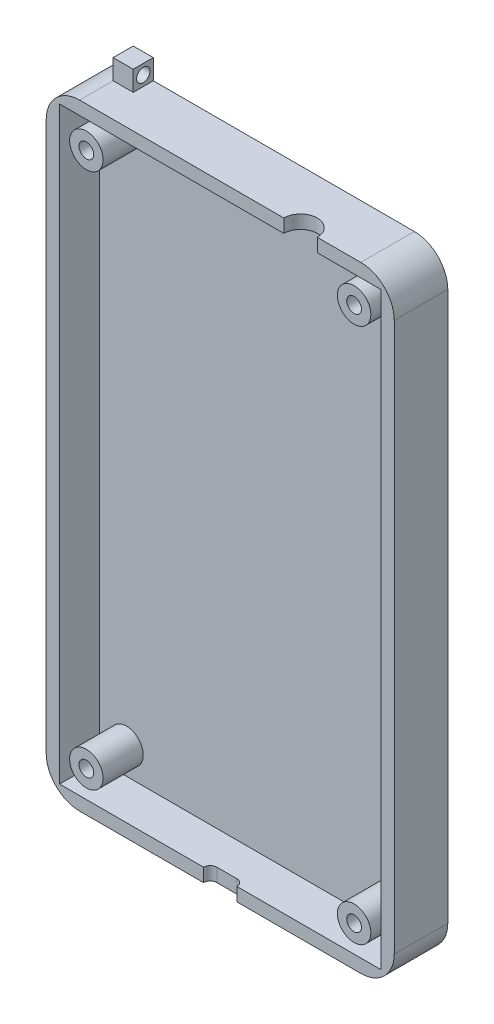
ISO-10303-21;
HEADER;
FILE_DESCRIPTION(('STEP AP214'),'2;1');
FILE_NAME('part.step','',(''),(''),'','','');
FILE_SCHEMA(('AUTOMOTIVE_DESIGN { 1 0 10303 214 1 1 1 1 }'));
ENDSEC;
DATA;
#1=APPLICATION_CONTEXT('core data for automotive mechanical design processes');
#2=APPLICATION_PROTOCOL_DEFINITION('international standard','automotive_design',2000,#1);
#3=PRODUCT_CONTEXT('',#1,'mechanical');
#4=PRODUCT('Part','Part','',(#3));
#5=PRODUCT_RELATED_PRODUCT_CATEGORY('part','',(#4));
#6=PRODUCT_DEFINITION_FORMATION('','',#4);
#7=PRODUCT_DEFINITION_CONTEXT('part definition',#1,'design');
#8=PRODUCT_DEFINITION('design','',#6,#7);
#9=PRODUCT_DEFINITION_SHAPE('','',#8);
#10=(LENGTH_UNIT() NAMED_UNIT(*) SI_UNIT(.MILLI.,.METRE.));
#11=(NAMED_UNIT(*) PLANE_ANGLE_UNIT() SI_UNIT($,.RADIAN.));
#12=(NAMED_UNIT(*) SI_UNIT($,.STERADIAN.) SOLID_ANGLE_UNIT());
#13=UNCERTAINTY_MEASURE_WITH_UNIT(LENGTH_MEASURE(1.E-05),#10,'distance_accuracy_value','');
#14=(GEOMETRIC_REPRESENTATION_CONTEXT(3) GLOBAL_UNCERTAINTY_ASSIGNED_CONTEXT((#13)) GLOBAL_UNIT_ASSIGNED_CONTEXT((#10,
#11,#12)) REPRESENTATION_CONTEXT('',''));
#15=CARTESIAN_POINT('',(0.,0.,0.));
#16=DIRECTION('',(0.,0.,1.));
#17=DIRECTION('',(1.,0.,0.));
#18=AXIS2_PLACEMENT_3D('',#15,#16,#17);
#19=CARTESIAN_POINT('',(24.,46.,8.));
#20=DIRECTION('',(0.,-1.,0.));
#21=DIRECTION('',(1.,0.,0.));
#22=AXIS2_PLACEMENT_3D('',#19,#20,#21);
#23=PLANE('',#22);
#24=DIRECTION('',(1.,0.,0.));
#25=VECTOR('',#24,1.);
#26=CARTESIAN_POINT('',(-21.,46.,3.));
#27=LINE('',#26,#25);
#28=CARTESIAN_POINT('',(-21.,46.,3.));
#29=VERTEX_POINT('',#28);
#30=CARTESIAN_POINT('',(-18.,46.,3.));
#31=VERTEX_POINT('',#30);
#32=EDGE_CURVE('E511',#29,#31,#27,.T.);
#33=ORIENTED_EDGE('',*,*,#32,.F.);
#34=DIRECTION('',(0.,0.,-1.));
#35=VECTOR('',#34,1.);
#36=CARTESIAN_POINT('',(-21.,46.,8.));
#37=LINE('',#36,#35);
#38=CARTESIAN_POINT('',(-21.,46.,8.));
#39=VERTEX_POINT('',#38);
#40=EDGE_CURVE('E382',#29,#39,#37,.F.);
#41=ORIENTED_EDGE('',*,*,#40,.T.);
#42=DIRECTION('',(-1.,0.,0.));
#43=VECTOR('',#42,1.);
#44=CARTESIAN_POINT('',(24.,46.,8.));
#45=LINE('',#44,#43);
#46=CARTESIAN_POINT('',(9.5,46.,8.));
#47=VERTEX_POINT('',#46);
#48=EDGE_CURVE('E377',#47,#39,#45,.T.);
#49=ORIENTED_EDGE('',*,*,#48,.F.);
#50=CARTESIAN_POINT('',(12.,46.,8.));
#51=DIRECTION('',(0.,1.,0.));
#52=DIRECTION('',(-1.,0.,0.));
#53=AXIS2_PLACEMENT_3D('',#50,#51,#52);
#54=CIRCLE('',#53,2.5);
#55=CARTESIAN_POINT('',(14.5,46.,8.));
#56=VERTEX_POINT('',#55);
#57=EDGE_CURVE('E258',#56,#47,#54,.T.);
#58=ORIENTED_EDGE('',*,*,#57,.F.);
#59=CARTESIAN_POINT('',(21.,46.,8.));
#60=VERTEX_POINT('',#59);
#61=EDGE_CURVE('E378',#60,#56,#45,.T.);
#62=ORIENTED_EDGE('',*,*,#61,.F.);
#63=DIRECTION('',(0.,0.,-1.));
#64=VECTOR('',#63,1.);
#65=CARTESIAN_POINT('',(21.,46.,8.));
#66=LINE('',#65,#64);
#67=CARTESIAN_POINT('',(21.,46.,0.));
#68=VERTEX_POINT('',#67);
#69=EDGE_CURVE('E398',#60,#68,#66,.T.);
#70=ORIENTED_EDGE('',*,*,#69,.T.);
#71=DIRECTION('',(-1.,0.,0.));
#72=VECTOR('',#71,1.);
#73=CARTESIAN_POINT('',(24.,46.,0.));
#74=LINE('',#73,#72);
#75=CARTESIAN_POINT('',(-18.,46.,0.));
#76=VERTEX_POINT('',#75);
#77=EDGE_CURVE('E88',#68,#76,#74,.T.);
#78=ORIENTED_EDGE('',*,*,#77,.T.);
#79=DIRECTION('',(0.,0.,-1.));
#80=VECTOR('',#79,1.);
#81=CARTESIAN_POINT('',(-18.,46.,0.));
#82=LINE('',#81,#80);
#83=EDGE_CURVE('E83',#31,#76,#82,.T.);
#84=ORIENTED_EDGE('',*,*,#83,.F.);
#85=EDGE_LOOP('',(#33,#41,#49,#58,#62,#70,#78,#84));
#86=FACE_BOUND('',#85,.T.);
#87=ADVANCED_FACE('F67',(#86),#23,.F.);
#88=CARTESIAN_POINT('',(0.,0.,8.));
#89=DIRECTION('',(0.,0.,1.));
#90=DIRECTION('',(1.,0.,0.));
#91=AXIS2_PLACEMENT_3D('',#88,#89,#90);
#92=PLANE('',#91);
#93=DIRECTION('',(0.,-1.,0.));
#94=VECTOR('',#93,1.);
#95=CARTESIAN_POINT('',(-2.5,0.,8.));
#96=LINE('',#95,#94);
#97=CARTESIAN_POINT('',(-2.5,-44.,8.));
#98=VERTEX_POINT('',#97);
#99=CARTESIAN_POINT('',(-2.5,-46.,8.));
#100=VERTEX_POINT('',#99);
#101=EDGE_CURVE('E254',#98,#100,#96,.T.);
#102=ORIENTED_EDGE('',*,*,#101,.F.);
#103=DIRECTION('',(1.,0.,0.));
#104=VECTOR('',#103,1.);
#105=CARTESIAN_POINT('',(24.,-44.,8.));
#106=LINE('',#105,#104);
#107=CARTESIAN_POINT('',(-24.,-44.,8.));
#108=VERTEX_POINT('',#107);
#109=EDGE_CURVE('E335',#108,#98,#106,.T.);
#110=ORIENTED_EDGE('',*,*,#109,.F.);
#111=DIRECTION('',(0.,-1.,0.));
#112=VECTOR('',#111,1.);
#113=CARTESIAN_POINT('',(-24.,-44.,8.));
#114=LINE('',#113,#112);
#115=CARTESIAN_POINT('',(-24.,44.,8.));
#116=VERTEX_POINT('',#115);
#117=EDGE_CURVE('E331',#116,#108,#114,.T.);
#118=ORIENTED_EDGE('',*,*,#117,.F.);
#119=DIRECTION('',(-1.,0.,0.));
#120=VECTOR('',#119,1.);
#121=CARTESIAN_POINT('',(24.,44.,8.));
#122=LINE('',#121,#120);
#123=CARTESIAN_POINT('',(9.5,44.,8.));
#124=VERTEX_POINT('',#123);
#125=EDGE_CURVE('E343',#124,#116,#122,.T.);
#126=ORIENTED_EDGE('',*,*,#125,.F.);
#127=DIRECTION('',(0.,1.,0.));
#128=VECTOR('',#127,1.);
#129=CARTESIAN_POINT('',(9.5,36.,8.));
#130=LINE('',#129,#128);
#131=EDGE_CURVE('E261',#47,#124,#130,.F.);
#132=ORIENTED_EDGE('',*,*,#131,.F.);
#133=ORIENTED_EDGE('',*,*,#48,.T.);
#134=CARTESIAN_POINT('',(-21.,41.,8.));
#135=DIRECTION('',(0.,0.,1.));
#136=DIRECTION('',(1.,0.,0.));
#137=AXIS2_PLACEMENT_3D('',#134,#135,#136);
#138=CIRCLE('',#137,5.);
#139=CARTESIAN_POINT('',(-26.,41.,8.));
#140=VERTEX_POINT('',#139);
#141=EDGE_CURVE('E420',#39,#140,#138,.T.);
#142=ORIENTED_EDGE('',*,*,#141,.T.);
#143=DIRECTION('',(0.,-1.,0.));
#144=VECTOR('',#143,1.);
#145=CARTESIAN_POINT('',(-26.,-44.,8.));
#146=LINE('',#145,#144);
#147=CARTESIAN_POINT('',(-26.,-41.,8.));
#148=VERTEX_POINT('',#147);
#149=EDGE_CURVE('E364',#140,#148,#146,.T.);
#150=ORIENTED_EDGE('',*,*,#149,.T.);
#151=CARTESIAN_POINT('',(-21.,-41.,8.));
#152=DIRECTION('',(0.,0.,1.));
#153=DIRECTION('',(1.,0.,0.));
#154=AXIS2_PLACEMENT_3D('',#151,#152,#153);
#155=CIRCLE('',#154,5.);
#156=CARTESIAN_POINT('',(-21.,-46.,8.));
#157=VERTEX_POINT('',#156);
#158=EDGE_CURVE('E423',#148,#157,#155,.T.);
#159=ORIENTED_EDGE('',*,*,#158,.T.);
#160=DIRECTION('',(1.,0.,0.));
#161=VECTOR('',#160,1.);
#162=CARTESIAN_POINT('',(24.,-46.,8.));
#163=LINE('',#162,#161);
#164=EDGE_CURVE('E369',#157,#100,#163,.T.);
#165=ORIENTED_EDGE('',*,*,#164,.T.);
#166=EDGE_LOOP('',(#102,#110,#118,#126,#132,#133,#142,#150,#159,#165));
#167=FACE_BOUND('',#166,.T.);
#168=ADVANCED_FACE('F516',(#167),#92,.T.);
#169=DIRECTION('',(0.,1.,0.));
#170=VECTOR('',#169,1.);
#171=CARTESIAN_POINT('',(2.5,0.,8.));
#172=LINE('',#171,#170);
#173=CARTESIAN_POINT('',(2.5,-46.,8.));
#174=VERTEX_POINT('',#173);
#175=CARTESIAN_POINT('',(2.5,-44.,8.));
#176=VERTEX_POINT('',#175);
#177=EDGE_CURVE('E245',#174,#176,#172,.T.);
#178=ORIENTED_EDGE('',*,*,#177,.F.);
#179=CARTESIAN_POINT('',(21.,-46.,8.));
#180=VERTEX_POINT('',#179);
#181=EDGE_CURVE('E368',#174,#180,#163,.T.);
#182=ORIENTED_EDGE('',*,*,#181,.T.);
#183=CARTESIAN_POINT('',(21.,-41.,8.));
#184=DIRECTION('',(0.,0.,1.));
#185=DIRECTION('',(1.,0.,0.));
#186=AXIS2_PLACEMENT_3D('',#183,#184,#185);
#187=CIRCLE('',#186,5.);
#188=CARTESIAN_POINT('',(26.,-41.,8.));
#189=VERTEX_POINT('',#188);
#190=EDGE_CURVE('E426',#180,#189,#187,.T.);
#191=ORIENTED_EDGE('',*,*,#190,.T.);
#192=DIRECTION('',(0.,1.,0.));
#193=VECTOR('',#192,1.);
#194=CARTESIAN_POINT('',(26.,-44.,8.));
#195=LINE('',#194,#193);
#196=CARTESIAN_POINT('',(26.,41.,8.));
#197=VERTEX_POINT('',#196);
#198=EDGE_CURVE('E373',#189,#197,#195,.T.);
#199=ORIENTED_EDGE('',*,*,#198,.T.);
#200=CARTESIAN_POINT('',(21.,41.,8.));
#201=DIRECTION('',(0.,0.,1.));
#202=DIRECTION('',(1.,0.,0.));
#203=AXIS2_PLACEMENT_3D('',#200,#201,#202);
#204=CIRCLE('',#203,5.);
#205=EDGE_CURVE('E429',#197,#60,#204,.T.);
#206=ORIENTED_EDGE('',*,*,#205,.T.);
#207=ORIENTED_EDGE('',*,*,#61,.T.);
#208=DIRECTION('',(0.,1.,0.));
#209=VECTOR('',#208,1.);
#210=CARTESIAN_POINT('',(14.5,36.,8.));
#211=LINE('',#210,#209);
#212=CARTESIAN_POINT('',(14.5,44.,8.));
#213=VERTEX_POINT('',#212);
#214=EDGE_CURVE('E264',#213,#56,#211,.T.);
#215=ORIENTED_EDGE('',*,*,#214,.F.);
#216=CARTESIAN_POINT('',(24.,44.,8.));
#217=VERTEX_POINT('',#216);
#218=EDGE_CURVE('E344',#217,#213,#122,.T.);
#219=ORIENTED_EDGE('',*,*,#218,.F.);
#220=DIRECTION('',(0.,1.,0.));
#221=VECTOR('',#220,1.);
#222=CARTESIAN_POINT('',(24.,-44.,8.));
#223=LINE('',#222,#221);
#224=CARTESIAN_POINT('',(24.,-44.,8.));
#225=VERTEX_POINT('',#224);
#226=EDGE_CURVE('E339',#225,#217,#223,.T.);
#227=ORIENTED_EDGE('',*,*,#226,.F.);
#228=EDGE_CURVE('E334',#176,#225,#106,.T.);
#229=ORIENTED_EDGE('',*,*,#228,.F.);
#230=EDGE_LOOP('',(#178,#182,#191,#199,#206,#207,#215,#219,#227,#229));
#231=FACE_BOUND('',#230,.T.);
#232=ADVANCED_FACE('F501',(#231),#92,.T.);
#233=CARTESIAN_POINT('',(0.,0.,0.));
#234=DIRECTION('',(0.,0.,1.));
#235=DIRECTION('',(1.,0.,0.));
#236=AXIS2_PLACEMENT_3D('',#233,#234,#235);
#237=PLANE('',#236);
#238=ORIENTED_EDGE('',*,*,#77,.F.);
#239=CARTESIAN_POINT('',(21.,41.,0.));
#240=DIRECTION('',(0.,0.,1.));
#241=DIRECTION('',(1.,0.,0.));
#242=AXIS2_PLACEMENT_3D('',#239,#240,#241);
#243=CIRCLE('',#242,5.);
#244=CARTESIAN_POINT('',(26.,41.,0.));
#245=VERTEX_POINT('',#244);
#246=EDGE_CURVE('E410',#68,#245,#243,.F.);
#247=ORIENTED_EDGE('',*,*,#246,.T.);
#248=DIRECTION('',(0.,1.,0.));
#249=VECTOR('',#248,1.);
#250=CARTESIAN_POINT('',(26.,-44.,0.));
#251=LINE('',#250,#249);
#252=CARTESIAN_POINT('',(26.,-41.,0.));
#253=VERTEX_POINT('',#252);
#254=EDGE_CURVE('E390',#253,#245,#251,.T.);
#255=ORIENTED_EDGE('',*,*,#254,.F.);
#256=CARTESIAN_POINT('',(21.,-41.,0.));
#257=DIRECTION('',(0.,0.,1.));
#258=DIRECTION('',(1.,0.,0.));
#259=AXIS2_PLACEMENT_3D('',#256,#257,#258);
#260=CIRCLE('',#259,5.);
#261=CARTESIAN_POINT('',(21.,-46.,0.));
#262=VERTEX_POINT('',#261);
#263=EDGE_CURVE('E407',#253,#262,#260,.F.);
#264=ORIENTED_EDGE('',*,*,#263,.T.);
#265=DIRECTION('',(1.,0.,0.));
#266=VECTOR('',#265,1.);
#267=CARTESIAN_POINT('',(24.,-46.,0.));
#268=LINE('',#267,#266);
#269=CARTESIAN_POINT('',(-21.,-46.,0.));
#270=VERTEX_POINT('',#269);
#271=EDGE_CURVE('E386',#270,#262,#268,.T.);
#272=ORIENTED_EDGE('',*,*,#271,.F.);
#273=CARTESIAN_POINT('',(-21.,-41.,0.));
#274=DIRECTION('',(0.,0.,1.));
#275=DIRECTION('',(1.,0.,0.));
#276=AXIS2_PLACEMENT_3D('',#273,#274,#275);
#277=CIRCLE('',#276,5.);
#278=CARTESIAN_POINT('',(-26.,-41.,0.));
#279=VERTEX_POINT('',#278);
#280=EDGE_CURVE('E404',#270,#279,#277,.F.);
#281=ORIENTED_EDGE('',*,*,#280,.T.);
#282=DIRECTION('',(0.,-1.,0.));
#283=VECTOR('',#282,1.);
#284=CARTESIAN_POINT('',(-26.,-44.,0.));
#285=LINE('',#284,#283);
#286=CARTESIAN_POINT('',(-26.,41.,0.));
#287=VERTEX_POINT('',#286);
#288=EDGE_CURVE('E363',#287,#279,#285,.T.);
#289=ORIENTED_EDGE('',*,*,#288,.F.);
#290=CARTESIAN_POINT('',(-21.,41.,0.));
#291=DIRECTION('',(0.,0.,1.));
#292=DIRECTION('',(1.,0.,0.));
#293=AXIS2_PLACEMENT_3D('',#290,#291,#292);
#294=CIRCLE('',#293,5.);
#295=CARTESIAN_POINT('',(-21.,46.,0.));
#296=VERTEX_POINT('',#295);
#297=EDGE_CURVE('E401',#287,#296,#294,.F.);
#298=ORIENTED_EDGE('',*,*,#297,.T.);
#299=DIRECTION('',(0.,-1.,0.));
#300=VECTOR('',#299,1.);
#301=CARTESIAN_POINT('',(-21.,49.,0.));
#302=LINE('',#301,#300);
#303=CARTESIAN_POINT('',(-21.,49.,0.));
#304=VERTEX_POINT('',#303);
#305=EDGE_CURVE('E700',#304,#296,#302,.T.);
#306=ORIENTED_EDGE('',*,*,#305,.F.);
#307=DIRECTION('',(-1.,0.,0.));
#308=VECTOR('',#307,1.);
#309=CARTESIAN_POINT('',(-21.,49.,0.));
#310=LINE('',#309,#308);
#311=CARTESIAN_POINT('',(-18.,49.,0.));
#312=VERTEX_POINT('',#311);
#313=EDGE_CURVE('E230',#312,#304,#310,.T.);
#314=ORIENTED_EDGE('',*,*,#313,.F.);
#315=DIRECTION('',(0.,-1.,0.));
#316=VECTOR('',#315,1.);
#317=CARTESIAN_POINT('',(-18.,49.,0.));
#318=LINE('',#317,#316);
#319=EDGE_CURVE('E247',#312,#76,#318,.T.);
#320=ORIENTED_EDGE('',*,*,#319,.T.);
#321=EDGE_LOOP('',(#238,#247,#255,#264,#272,#281,#289,#298,#306,#314,#320));
#322=FACE_BOUND('',#321,.T.);
#323=ADVANCED_FACE('F526',(#322),#237,.F.);
#324=CARTESIAN_POINT('',(-26.,-44.,8.));
#325=DIRECTION('',(1.,0.,0.));
#326=DIRECTION('',(0.,0.,-1.));
#327=AXIS2_PLACEMENT_3D('',#324,#325,#326);
#328=PLANE('',#327);
#329=ORIENTED_EDGE('',*,*,#288,.T.);
#330=DIRECTION('',(0.,0.,-1.));
#331=VECTOR('',#330,1.);
#332=CARTESIAN_POINT('',(-26.,-41.,8.));
#333=LINE('',#332,#331);
#334=EDGE_CURVE('E444',#279,#148,#333,.F.);
#335=ORIENTED_EDGE('',*,*,#334,.T.);
#336=ORIENTED_EDGE('',*,*,#149,.F.);
#337=DIRECTION('',(0.,0.,-1.));
#338=VECTOR('',#337,1.);
#339=CARTESIAN_POINT('',(-26.,41.,8.));
#340=LINE('',#339,#338);
#341=EDGE_CURVE('E440',#140,#287,#340,.T.);
#342=ORIENTED_EDGE('',*,*,#341,.T.);
#343=EDGE_LOOP('',(#329,#335,#336,#342));
#344=FACE_BOUND('',#343,.T.);
#345=ADVANCED_FACE('F523',(#344),#328,.F.);
#346=CARTESIAN_POINT('',(24.,-46.,8.));
#347=DIRECTION('',(0.,1.,0.));
#348=DIRECTION('',(-1.,0.,0.));
#349=AXIS2_PLACEMENT_3D('',#346,#347,#348);
#350=PLANE('',#349);
#351=DIRECTION('',(1.,0.,0.));
#352=VECTOR('',#351,1.);
#353=CARTESIAN_POINT('',(2.5,-46.,7.));
#354=LINE('',#353,#352);
#355=CARTESIAN_POINT('',(-1.5,-46.,7.));
#356=VERTEX_POINT('',#355);
#357=CARTESIAN_POINT('',(1.5,-46.,7.));
#358=VERTEX_POINT('',#357);
#359=EDGE_CURVE('E240',#356,#358,#354,.T.);
#360=ORIENTED_EDGE('',*,*,#359,.F.);
#361=CARTESIAN_POINT('',(-1.5,-46.,8.));
#362=DIRECTION('',(0.,1.,0.));
#363=DIRECTION('',(-1.,0.,0.));
#364=AXIS2_PLACEMENT_3D('',#361,#362,#363);
#365=CIRCLE('',#364,1.);
#366=EDGE_CURVE('E477',#356,#100,#365,.T.);
#367=ORIENTED_EDGE('',*,*,#366,.T.);
#368=ORIENTED_EDGE('',*,*,#164,.F.);
#369=DIRECTION('',(0.,0.,-1.));
#370=VECTOR('',#369,1.);
#371=CARTESIAN_POINT('',(-21.,-46.,8.));
#372=LINE('',#371,#370);
#373=EDGE_CURVE('E432',#157,#270,#372,.T.);
#374=ORIENTED_EDGE('',*,*,#373,.T.);
#375=ORIENTED_EDGE('',*,*,#271,.T.);
#376=DIRECTION('',(0.,0.,-1.));
#377=VECTOR('',#376,1.);
#378=CARTESIAN_POINT('',(21.,-46.,8.));
#379=LINE('',#378,#377);
#380=EDGE_CURVE('E436',#262,#180,#379,.F.);
#381=ORIENTED_EDGE('',*,*,#380,.T.);
#382=ORIENTED_EDGE('',*,*,#181,.F.);
#383=CARTESIAN_POINT('',(1.5,-46.,8.));
#384=DIRECTION('',(0.,1.,0.));
#385=DIRECTION('',(-1.,0.,0.));
#386=AXIS2_PLACEMENT_3D('',#383,#384,#385);
#387=CIRCLE('',#386,1.);
#388=EDGE_CURVE('E76',#174,#358,#387,.T.);
#389=ORIENTED_EDGE('',*,*,#388,.T.);
#390=EDGE_LOOP('',(#360,#367,#368,#374,#375,#381,#382,#389));
#391=FACE_BOUND('',#390,.T.);
#392=ADVANCED_FACE('F486',(#391),#350,.F.);
#393=CARTESIAN_POINT('',(26.,-44.,8.));
#394=DIRECTION('',(-1.,0.,0.));
#395=DIRECTION('',(0.,-1.,0.));
#396=AXIS2_PLACEMENT_3D('',#393,#394,#395);
#397=PLANE('',#396);
#398=ORIENTED_EDGE('',*,*,#254,.T.);
#399=DIRECTION('',(0.,0.,-1.));
#400=VECTOR('',#399,1.);
#401=CARTESIAN_POINT('',(26.,41.,8.));
#402=LINE('',#401,#400);
#403=EDGE_CURVE('E417',#245,#197,#402,.F.);
#404=ORIENTED_EDGE('',*,*,#403,.T.);
#405=ORIENTED_EDGE('',*,*,#198,.F.);
#406=DIRECTION('',(0.,0.,-1.));
#407=VECTOR('',#406,1.);
#408=CARTESIAN_POINT('',(26.,-41.,8.));
#409=LINE('',#408,#407);
#410=EDGE_CURVE('E413',#189,#253,#409,.T.);
#411=ORIENTED_EDGE('',*,*,#410,.T.);
#412=EDGE_LOOP('',(#398,#404,#405,#411));
#413=FACE_BOUND('',#412,.T.);
#414=ADVANCED_FACE('F559',(#413),#397,.F.);
#415=CARTESIAN_POINT('',(-24.,-44.,8.));
#416=DIRECTION('',(1.,0.,0.));
#417=DIRECTION('',(0.,0.,-1.));
#418=AXIS2_PLACEMENT_3D('',#415,#416,#417);
#419=PLANE('',#418);
#420=DIRECTION('',(0.,-1.,0.));
#421=VECTOR('',#420,1.);
#422=CARTESIAN_POINT('',(-24.,44.,2.));
#423=LINE('',#422,#421);
#424=CARTESIAN_POINT('',(-24.,44.,2.));
#425=VERTEX_POINT('',#424);
#426=CARTESIAN_POINT('',(-24.,-44.,2.));
#427=VERTEX_POINT('',#426);
#428=EDGE_CURVE('E312',#425,#427,#423,.T.);
#429=ORIENTED_EDGE('',*,*,#428,.F.);
#430=DIRECTION('',(0.,0.,-1.));
#431=VECTOR('',#430,1.);
#432=CARTESIAN_POINT('',(-24.,44.,8.));
#433=LINE('',#432,#431);
#434=EDGE_CURVE('E348',#116,#425,#433,.T.);
#435=ORIENTED_EDGE('',*,*,#434,.F.);
#436=ORIENTED_EDGE('',*,*,#117,.T.);
#437=DIRECTION('',(0.,0.,-1.));
#438=VECTOR('',#437,1.);
#439=CARTESIAN_POINT('',(-24.,-44.,8.));
#440=LINE('',#439,#438);
#441=EDGE_CURVE('E359',#108,#427,#440,.T.);
#442=ORIENTED_EDGE('',*,*,#441,.T.);
#443=EDGE_LOOP('',(#429,#435,#436,#442));
#444=FACE_BOUND('',#443,.T.);
#445=ADVANCED_FACE('F543',(#444),#419,.T.);
#446=CARTESIAN_POINT('',(24.,-44.,8.));
#447=DIRECTION('',(0.,1.,0.));
#448=DIRECTION('',(-1.,0.,0.));
#449=AXIS2_PLACEMENT_3D('',#446,#447,#448);
#450=PLANE('',#449);
#451=ORIENTED_EDGE('',*,*,#109,.T.);
#452=CARTESIAN_POINT('',(-1.5,-44.,8.));
#453=DIRECTION('',(0.,1.,0.));
#454=DIRECTION('',(-1.,0.,0.));
#455=AXIS2_PLACEMENT_3D('',#452,#453,#454);
#456=CIRCLE('',#455,1.);
#457=CARTESIAN_POINT('',(-1.5,-44.,7.));
#458=VERTEX_POINT('',#457);
#459=EDGE_CURVE('E480',#98,#458,#456,.F.);
#460=ORIENTED_EDGE('',*,*,#459,.T.);
#461=DIRECTION('',(-1.,0.,0.));
#462=VECTOR('',#461,1.);
#463=CARTESIAN_POINT('',(24.,-44.,7.00000000000001));
#464=LINE('',#463,#462);
#465=CARTESIAN_POINT('',(1.5,-44.,7.));
#466=VERTEX_POINT('',#465);
#467=EDGE_CURVE('E466',#466,#458,#464,.T.);
#468=ORIENTED_EDGE('',*,*,#467,.F.);
#469=CARTESIAN_POINT('',(1.5,-44.,8.));
#470=DIRECTION('',(0.,1.,0.));
#471=DIRECTION('',(-1.,0.,0.));
#472=AXIS2_PLACEMENT_3D('',#469,#470,#471);
#473=CIRCLE('',#472,1.);
#474=EDGE_CURVE('E12',#466,#176,#473,.F.);
#475=ORIENTED_EDGE('',*,*,#474,.T.);
#476=ORIENTED_EDGE('',*,*,#228,.T.);
#477=DIRECTION('',(0.,0.,-1.));
#478=VECTOR('',#477,1.);
#479=CARTESIAN_POINT('',(24.,-44.,8.));
#480=LINE('',#479,#478);
#481=CARTESIAN_POINT('',(24.,-44.,2.));
#482=VERTEX_POINT('',#481);
#483=EDGE_CURVE('E355',#225,#482,#480,.T.);
#484=ORIENTED_EDGE('',*,*,#483,.T.);
#485=DIRECTION('',(1.,0.,0.));
#486=VECTOR('',#485,1.);
#487=CARTESIAN_POINT('',(-24.,-44.,2.));
#488=LINE('',#487,#486);
#489=EDGE_CURVE('E319',#427,#482,#488,.T.);
#490=ORIENTED_EDGE('',*,*,#489,.F.);
#491=ORIENTED_EDGE('',*,*,#441,.F.);
#492=EDGE_LOOP('',(#451,#460,#468,#475,#476,#484,#490,#491));
#493=FACE_BOUND('',#492,.T.);
#494=ADVANCED_FACE('F497',(#493),#450,.T.);
#495=CARTESIAN_POINT('',(24.,-44.,8.));
#496=DIRECTION('',(-1.,0.,0.));
#497=DIRECTION('',(0.,-1.,0.));
#498=AXIS2_PLACEMENT_3D('',#495,#496,#497);
#499=PLANE('',#498);
#500=DIRECTION('',(0.,1.,0.));
#501=VECTOR('',#500,1.);
#502=CARTESIAN_POINT('',(24.,44.,2.));
#503=LINE('',#502,#501);
#504=CARTESIAN_POINT('',(24.,44.,2.));
#505=VERTEX_POINT('',#504);
#506=EDGE_CURVE('E323',#482,#505,#503,.T.);
#507=ORIENTED_EDGE('',*,*,#506,.F.);
#508=ORIENTED_EDGE('',*,*,#483,.F.);
#509=ORIENTED_EDGE('',*,*,#226,.T.);
#510=DIRECTION('',(0.,0.,-1.));
#511=VECTOR('',#510,1.);
#512=CARTESIAN_POINT('',(24.,44.,8.));
#513=LINE('',#512,#511);
#514=EDGE_CURVE('E351',#217,#505,#513,.T.);
#515=ORIENTED_EDGE('',*,*,#514,.T.);
#516=EDGE_LOOP('',(#507,#508,#509,#515));
#517=FACE_BOUND('',#516,.T.);
#518=ADVANCED_FACE('F604',(#517),#499,.T.);
#519=CARTESIAN_POINT('',(24.,44.,8.));
#520=DIRECTION('',(0.,-1.,0.));
#521=DIRECTION('',(1.,0.,0.));
#522=AXIS2_PLACEMENT_3D('',#519,#520,#521);
#523=PLANE('',#522);
#524=CARTESIAN_POINT('',(12.,44.,8.));
#525=DIRECTION('',(0.,-1.,0.));
#526=DIRECTION('',(1.,0.,0.));
#527=AXIS2_PLACEMENT_3D('',#524,#525,#526);
#528=CIRCLE('',#527,2.5);
#529=EDGE_CURVE('E463',#124,#213,#528,.T.);
#530=ORIENTED_EDGE('',*,*,#529,.F.);
#531=ORIENTED_EDGE('',*,*,#125,.T.);
#532=ORIENTED_EDGE('',*,*,#434,.T.);
#533=DIRECTION('',(-1.,0.,0.));
#534=VECTOR('',#533,1.);
#535=CARTESIAN_POINT('',(-24.,44.,2.));
#536=LINE('',#535,#534);
#537=EDGE_CURVE('E327',#505,#425,#536,.T.);
#538=ORIENTED_EDGE('',*,*,#537,.F.);
#539=ORIENTED_EDGE('',*,*,#514,.F.);
#540=ORIENTED_EDGE('',*,*,#218,.T.);
#541=EDGE_LOOP('',(#530,#531,#532,#538,#539,#540));
#542=FACE_BOUND('',#541,.T.);
#543=ADVANCED_FACE('F546',(#542),#523,.T.);
#544=CARTESIAN_POINT('',(0.,0.,2.));
#545=DIRECTION('',(0.,0.,1.));
#546=DIRECTION('',(1.,0.,0.));
#547=AXIS2_PLACEMENT_3D('',#544,#545,#546);
#548=PLANE('',#547);
#549=CARTESIAN_POINT('',(20.,40.,2.));
#550=DIRECTION('',(0.,0.,1.));
#551=DIRECTION('',(1.,0.,0.));
#552=AXIS2_PLACEMENT_3D('',#549,#550,#551);
#553=CIRCLE('',#552,2.5);
#554=CARTESIAN_POINT('',(22.5,40.,2.));
#555=VERTEX_POINT('',#554);
#556=EDGE_CURVE('E268',#555,#555,#553,.T.);
#557=ORIENTED_EDGE('',*,*,#556,.F.);
#558=EDGE_LOOP('',(#557));
#559=FACE_BOUND('',#558,.T.);
#560=CARTESIAN_POINT('',(20.,-40.,2.));
#561=DIRECTION('',(0.,0.,1.));
#562=DIRECTION('',(1.,0.,0.));
#563=AXIS2_PLACEMENT_3D('',#560,#561,#562);
#564=CIRCLE('',#563,2.5);
#565=CARTESIAN_POINT('',(22.5,-40.,2.));
#566=VERTEX_POINT('',#565);
#567=EDGE_CURVE('E280',#566,#566,#564,.T.);
#568=ORIENTED_EDGE('',*,*,#567,.F.);
#569=EDGE_LOOP('',(#568));
#570=FACE_BOUND('',#569,.T.);
#571=CARTESIAN_POINT('',(-20.,-40.,2.));
#572=DIRECTION('',(0.,0.,1.));
#573=DIRECTION('',(1.,0.,0.));
#574=AXIS2_PLACEMENT_3D('',#571,#572,#573);
#575=CIRCLE('',#574,2.5);
#576=CARTESIAN_POINT('',(-17.5,-40.,2.));
#577=VERTEX_POINT('',#576);
#578=EDGE_CURVE('E292',#577,#577,#575,.T.);
#579=ORIENTED_EDGE('',*,*,#578,.F.);
#580=EDGE_LOOP('',(#579));
#581=FACE_BOUND('',#580,.T.);
#582=CARTESIAN_POINT('',(-20.,40.,2.));
#583=DIRECTION('',(0.,0.,1.));
#584=DIRECTION('',(1.,0.,0.));
#585=AXIS2_PLACEMENT_3D('',#582,#583,#584);
#586=CIRCLE('',#585,2.5);
#587=CARTESIAN_POINT('',(-17.5,40.,2.));
#588=VERTEX_POINT('',#587);
#589=EDGE_CURVE('E307',#588,#588,#586,.T.);
#590=ORIENTED_EDGE('',*,*,#589,.F.);
#591=EDGE_LOOP('',(#590));
#592=FACE_BOUND('',#591,.T.);
#593=ORIENTED_EDGE('',*,*,#428,.T.);
#594=ORIENTED_EDGE('',*,*,#489,.T.);
#595=ORIENTED_EDGE('',*,*,#506,.T.);
#596=ORIENTED_EDGE('',*,*,#537,.T.);
#597=EDGE_LOOP('',(#593,#594,#595,#596));
#598=FACE_BOUND('',#597,.T.);
#599=ADVANCED_FACE('F572',(#559,#570,#581,#592,#598),#548,.T.);
#600=CARTESIAN_POINT('',(21.,41.,8.));
#601=DIRECTION('',(0.,0.,-1.));
#602=DIRECTION('',(-1.,0.,0.));
#603=AXIS2_PLACEMENT_3D('',#600,#601,#602);
#604=CYLINDRICAL_SURFACE('',#603,5.);
#605=ORIENTED_EDGE('',*,*,#205,.F.);
#606=ORIENTED_EDGE('',*,*,#403,.F.);
#607=ORIENTED_EDGE('',*,*,#246,.F.);
#608=ORIENTED_EDGE('',*,*,#69,.F.);
#609=EDGE_LOOP('',(#605,#606,#607,#608));
#610=FACE_BOUND('',#609,.T.);
#611=ADVANCED_FACE('F554',(#610),#604,.T.);
#612=CARTESIAN_POINT('',(21.,-41.,8.));
#613=DIRECTION('',(0.,0.,-1.));
#614=DIRECTION('',(-1.,0.,0.));
#615=AXIS2_PLACEMENT_3D('',#612,#613,#614);
#616=CYLINDRICAL_SURFACE('',#615,5.);
#617=ORIENTED_EDGE('',*,*,#190,.F.);
#618=ORIENTED_EDGE('',*,*,#380,.F.);
#619=ORIENTED_EDGE('',*,*,#263,.F.);
#620=ORIENTED_EDGE('',*,*,#410,.F.);
#621=EDGE_LOOP('',(#617,#618,#619,#620));
#622=FACE_BOUND('',#621,.T.);
#623=ADVANCED_FACE('F564',(#622),#616,.T.);
#624=CARTESIAN_POINT('',(-21.,-41.,8.));
#625=DIRECTION('',(0.,0.,-1.));
#626=DIRECTION('',(-1.,0.,0.));
#627=AXIS2_PLACEMENT_3D('',#624,#625,#626);
#628=CYLINDRICAL_SURFACE('',#627,5.);
#629=ORIENTED_EDGE('',*,*,#158,.F.);
#630=ORIENTED_EDGE('',*,*,#334,.F.);
#631=ORIENTED_EDGE('',*,*,#280,.F.);
#632=ORIENTED_EDGE('',*,*,#373,.F.);
#633=EDGE_LOOP('',(#629,#630,#631,#632));
#634=FACE_BOUND('',#633,.T.);
#635=ADVANCED_FACE('F531',(#634),#628,.T.);
#636=CARTESIAN_POINT('',(-21.,41.,8.));
#637=DIRECTION('',(0.,0.,-1.));
#638=DIRECTION('',(-1.,0.,0.));
#639=AXIS2_PLACEMENT_3D('',#636,#637,#638);
#640=CYLINDRICAL_SURFACE('',#639,5.);
#641=ORIENTED_EDGE('',*,*,#141,.F.);
#642=ORIENTED_EDGE('',*,*,#40,.F.);
#643=EDGE_CURVE('E238',#296,#29,#37,.F.);
#644=ORIENTED_EDGE('',*,*,#643,.F.);
#645=ORIENTED_EDGE('',*,*,#297,.F.);
#646=ORIENTED_EDGE('',*,*,#341,.F.);
#647=EDGE_LOOP('',(#641,#642,#644,#645,#646));
#648=FACE_BOUND('',#647,.T.);
#649=ADVANCED_FACE('F520',(#648),#640,.T.);
#650=CARTESIAN_POINT('',(-20.,40.,8.));
#651=DIRECTION('',(0.,0.,1.));
#652=DIRECTION('',(1.,0.,0.));
#653=AXIS2_PLACEMENT_3D('',#650,#651,#652);
#654=PLANE('',#653);
#655=CARTESIAN_POINT('',(-20.,40.,8.));
#656=DIRECTION('',(0.,0.,1.));
#657=DIRECTION('',(1.,0.,0.));
#658=AXIS2_PLACEMENT_3D('',#655,#656,#657);
#659=CIRCLE('',#658,2.5);
#660=CARTESIAN_POINT('',(-17.5,40.,8.));
#661=VERTEX_POINT('',#660);
#662=EDGE_CURVE('E308',#661,#661,#659,.T.);
#663=ORIENTED_EDGE('',*,*,#662,.T.);
#664=EDGE_LOOP('',(#663));
#665=FACE_BOUND('',#664,.T.);
#666=CARTESIAN_POINT('',(-20.,40.,8.));
#667=DIRECTION('',(0.,0.,1.));
#668=DIRECTION('',(1.,0.,0.));
#669=AXIS2_PLACEMENT_3D('',#666,#667,#668);
#670=CIRCLE('',#669,1.09999999999999);
#671=CARTESIAN_POINT('',(-18.9,40.,8.));
#672=VERTEX_POINT('',#671);
#673=EDGE_CURVE('E303',#672,#672,#670,.T.);
#674=ORIENTED_EDGE('',*,*,#673,.F.);
#675=EDGE_LOOP('',(#674));
#676=FACE_BOUND('',#675,.T.);
#677=ADVANCED_FACE('F619',(#665,#676),#654,.T.);
#678=CARTESIAN_POINT('',(-20.,40.,8.));
#679=DIRECTION('',(0.,0.,-1.));
#680=DIRECTION('',(-1.,0.,0.));
#681=AXIS2_PLACEMENT_3D('',#678,#679,#680);
#682=CYLINDRICAL_SURFACE('',#681,2.5);
#683=ORIENTED_EDGE('',*,*,#662,.F.);
#684=EDGE_LOOP('',(#683));
#685=FACE_BOUND('',#684,.T.);
#686=ORIENTED_EDGE('',*,*,#589,.T.);
#687=EDGE_LOOP('',(#686));
#688=FACE_BOUND('',#687,.T.);
#689=ADVANCED_FACE('F615',(#685,#688),#682,.T.);
#690=CARTESIAN_POINT('',(-20.,40.,8.));
#691=DIRECTION('',(0.,0.,-1.));
#692=DIRECTION('',(-1.,0.,0.));
#693=AXIS2_PLACEMENT_3D('',#690,#691,#692);
#694=CYLINDRICAL_SURFACE('',#693,1.09999999999999);
#695=ORIENTED_EDGE('',*,*,#673,.T.);
#696=EDGE_LOOP('',(#695));
#697=FACE_BOUND('',#696,.T.);
#698=CARTESIAN_POINT('',(-20.,40.,2.));
#699=DIRECTION('',(0.,0.,1.));
#700=DIRECTION('',(1.,0.,0.));
#701=AXIS2_PLACEMENT_3D('',#698,#699,#700);
#702=CIRCLE('',#701,1.09999999999999);
#703=CARTESIAN_POINT('',(-18.9,40.,2.));
#704=VERTEX_POINT('',#703);
#705=EDGE_CURVE('E447',#704,#704,#702,.F.);
#706=ORIENTED_EDGE('',*,*,#705,.T.);
#707=EDGE_LOOP('',(#706));
#708=FACE_BOUND('',#707,.T.);
#709=ADVANCED_FACE('F618',(#697,#708),#694,.F.);
#710=ORIENTED_EDGE('',*,*,#705,.F.);
#711=EDGE_LOOP('',(#710));
#712=FACE_BOUND('',#711,.T.);
#713=ADVANCED_FACE('F614',(#712),#548,.T.);
#714=CARTESIAN_POINT('',(-20.,-40.,8.));
#715=DIRECTION('',(0.,0.,1.));
#716=DIRECTION('',(1.,0.,0.));
#717=AXIS2_PLACEMENT_3D('',#714,#715,#716);
#718=PLANE('',#717);
#719=CARTESIAN_POINT('',(-20.,-40.,8.));
#720=DIRECTION('',(0.,0.,1.));
#721=DIRECTION('',(1.,0.,0.));
#722=AXIS2_PLACEMENT_3D('',#719,#720,#721);
#723=CIRCLE('',#722,2.5);
#724=CARTESIAN_POINT('',(-17.5,-40.,8.));
#725=VERTEX_POINT('',#724);
#726=EDGE_CURVE('E291',#725,#725,#723,.T.);
#727=ORIENTED_EDGE('',*,*,#726,.T.);
#728=EDGE_LOOP('',(#727));
#729=FACE_BOUND('',#728,.T.);
#730=CARTESIAN_POINT('',(-20.,-40.,8.));
#731=DIRECTION('',(0.,0.,1.));
#732=DIRECTION('',(1.,0.,0.));
#733=AXIS2_PLACEMENT_3D('',#730,#731,#732);
#734=CIRCLE('',#733,1.09999999999999);
#735=CARTESIAN_POINT('',(-18.9,-40.,8.));
#736=VERTEX_POINT('',#735);
#737=EDGE_CURVE('E296',#736,#736,#734,.T.);
#738=ORIENTED_EDGE('',*,*,#737,.F.);
#739=EDGE_LOOP('',(#738));
#740=FACE_BOUND('',#739,.T.);
#741=ADVANCED_FACE('F633',(#729,#740),#718,.T.);
#742=CARTESIAN_POINT('',(-20.,-40.,8.));
#743=DIRECTION('',(0.,0.,-1.));
#744=DIRECTION('',(-1.,0.,0.));
#745=AXIS2_PLACEMENT_3D('',#742,#743,#744);
#746=CYLINDRICAL_SURFACE('',#745,2.5);
#747=ORIENTED_EDGE('',*,*,#726,.F.);
#748=EDGE_LOOP('',(#747));
#749=FACE_BOUND('',#748,.T.);
#750=ORIENTED_EDGE('',*,*,#578,.T.);
#751=EDGE_LOOP('',(#750));
#752=FACE_BOUND('',#751,.T.);
#753=ADVANCED_FACE('F631',(#749,#752),#746,.T.);
#754=CARTESIAN_POINT('',(-20.,-40.,8.));
#755=DIRECTION('',(0.,0.,-1.));
#756=DIRECTION('',(-1.,0.,0.));
#757=AXIS2_PLACEMENT_3D('',#754,#755,#756);
#758=CYLINDRICAL_SURFACE('',#757,1.09999999999999);
#759=ORIENTED_EDGE('',*,*,#737,.T.);
#760=EDGE_LOOP('',(#759));
#761=FACE_BOUND('',#760,.T.);
#762=CARTESIAN_POINT('',(-20.,-40.,2.));
#763=DIRECTION('',(0.,0.,1.));
#764=DIRECTION('',(1.,0.,0.));
#765=AXIS2_PLACEMENT_3D('',#762,#763,#764);
#766=CIRCLE('',#765,1.09999999999999);
#767=CARTESIAN_POINT('',(-18.9,-40.,2.));
#768=VERTEX_POINT('',#767);
#769=EDGE_CURVE('E451',#768,#768,#766,.F.);
#770=ORIENTED_EDGE('',*,*,#769,.T.);
#771=EDGE_LOOP('',(#770));
#772=FACE_BOUND('',#771,.T.);
#773=ADVANCED_FACE('F627',(#761,#772),#758,.F.);
#774=ORIENTED_EDGE('',*,*,#769,.F.);
#775=EDGE_LOOP('',(#774));
#776=FACE_BOUND('',#775,.T.);
#777=ADVANCED_FACE('F630',(#776),#548,.T.);
#778=CARTESIAN_POINT('',(20.,-40.,8.));
#779=DIRECTION('',(0.,0.,1.));
#780=DIRECTION('',(1.,0.,0.));
#781=AXIS2_PLACEMENT_3D('',#778,#779,#780);
#782=PLANE('',#781);
#783=CARTESIAN_POINT('',(20.,-40.,8.));
#784=DIRECTION('',(0.,0.,1.));
#785=DIRECTION('',(1.,0.,0.));
#786=AXIS2_PLACEMENT_3D('',#783,#784,#785);
#787=CIRCLE('',#786,2.5);
#788=CARTESIAN_POINT('',(22.5,-40.,8.));
#789=VERTEX_POINT('',#788);
#790=EDGE_CURVE('E279',#789,#789,#787,.T.);
#791=ORIENTED_EDGE('',*,*,#790,.T.);
#792=EDGE_LOOP('',(#791));
#793=FACE_BOUND('',#792,.T.);
#794=CARTESIAN_POINT('',(20.,-40.,8.));
#795=DIRECTION('',(0.,0.,1.));
#796=DIRECTION('',(1.,0.,0.));
#797=AXIS2_PLACEMENT_3D('',#794,#795,#796);
#798=CIRCLE('',#797,1.09999999999999);
#799=CARTESIAN_POINT('',(21.1,-40.,8.));
#800=VERTEX_POINT('',#799);
#801=EDGE_CURVE('E284',#800,#800,#798,.T.);
#802=ORIENTED_EDGE('',*,*,#801,.F.);
#803=EDGE_LOOP('',(#802));
#804=FACE_BOUND('',#803,.T.);
#805=ADVANCED_FACE('F646',(#793,#804),#782,.T.);
#806=CARTESIAN_POINT('',(20.,-40.,8.));
#807=DIRECTION('',(0.,0.,-1.));
#808=DIRECTION('',(-1.,0.,0.));
#809=AXIS2_PLACEMENT_3D('',#806,#807,#808);
#810=CYLINDRICAL_SURFACE('',#809,2.5);
#811=ORIENTED_EDGE('',*,*,#790,.F.);
#812=EDGE_LOOP('',(#811));
#813=FACE_BOUND('',#812,.T.);
#814=ORIENTED_EDGE('',*,*,#567,.T.);
#815=EDGE_LOOP('',(#814));
#816=FACE_BOUND('',#815,.T.);
#817=ADVANCED_FACE('F644',(#813,#816),#810,.T.);
#818=CARTESIAN_POINT('',(20.,-40.,8.));
#819=DIRECTION('',(0.,0.,-1.));
#820=DIRECTION('',(-1.,0.,0.));
#821=AXIS2_PLACEMENT_3D('',#818,#819,#820);
#822=CYLINDRICAL_SURFACE('',#821,1.09999999999999);
#823=ORIENTED_EDGE('',*,*,#801,.T.);
#824=EDGE_LOOP('',(#823));
#825=FACE_BOUND('',#824,.T.);
#826=CARTESIAN_POINT('',(20.,-40.,2.));
#827=DIRECTION('',(0.,0.,1.));
#828=DIRECTION('',(1.,0.,0.));
#829=AXIS2_PLACEMENT_3D('',#826,#827,#828);
#830=CIRCLE('',#829,1.09999999999999);
#831=CARTESIAN_POINT('',(21.1,-40.,2.));
#832=VERTEX_POINT('',#831);
#833=EDGE_CURVE('E455',#832,#832,#830,.F.);
#834=ORIENTED_EDGE('',*,*,#833,.T.);
#835=EDGE_LOOP('',(#834));
#836=FACE_BOUND('',#835,.T.);
#837=ADVANCED_FACE('F640',(#825,#836),#822,.F.);
#838=ORIENTED_EDGE('',*,*,#833,.F.);
#839=EDGE_LOOP('',(#838));
#840=FACE_BOUND('',#839,.T.);
#841=ADVANCED_FACE('F643',(#840),#548,.T.);
#842=CARTESIAN_POINT('',(20.,40.,8.));
#843=DIRECTION('',(0.,0.,1.));
#844=DIRECTION('',(1.,0.,0.));
#845=AXIS2_PLACEMENT_3D('',#842,#843,#844);
#846=PLANE('',#845);
#847=CARTESIAN_POINT('',(20.,40.,8.));
#848=DIRECTION('',(0.,0.,1.));
#849=DIRECTION('',(1.,0.,0.));
#850=AXIS2_PLACEMENT_3D('',#847,#848,#849);
#851=CIRCLE('',#850,2.5);
#852=CARTESIAN_POINT('',(22.5,40.,8.));
#853=VERTEX_POINT('',#852);
#854=EDGE_CURVE('E267',#853,#853,#851,.T.);
#855=ORIENTED_EDGE('',*,*,#854,.T.);
#856=EDGE_LOOP('',(#855));
#857=FACE_BOUND('',#856,.T.);
#858=CARTESIAN_POINT('',(20.,40.,8.));
#859=DIRECTION('',(0.,0.,1.));
#860=DIRECTION('',(1.,0.,0.));
#861=AXIS2_PLACEMENT_3D('',#858,#859,#860);
#862=CIRCLE('',#861,1.09999999999999);
#863=CARTESIAN_POINT('',(21.1,40.,8.));
#864=VERTEX_POINT('',#863);
#865=EDGE_CURVE('E272',#864,#864,#862,.T.);
#866=ORIENTED_EDGE('',*,*,#865,.F.);
#867=EDGE_LOOP('',(#866));
#868=FACE_BOUND('',#867,.T.);
#869=ADVANCED_FACE('F658',(#857,#868),#846,.T.);
#870=CARTESIAN_POINT('',(20.,40.,8.));
#871=DIRECTION('',(0.,0.,-1.));
#872=DIRECTION('',(-1.,0.,0.));
#873=AXIS2_PLACEMENT_3D('',#870,#871,#872);
#874=CYLINDRICAL_SURFACE('',#873,2.5);
#875=ORIENTED_EDGE('',*,*,#854,.F.);
#876=EDGE_LOOP('',(#875));
#877=FACE_BOUND('',#876,.T.);
#878=ORIENTED_EDGE('',*,*,#556,.T.);
#879=EDGE_LOOP('',(#878));
#880=FACE_BOUND('',#879,.T.);
#881=ADVANCED_FACE('F656',(#877,#880),#874,.T.);
#882=CARTESIAN_POINT('',(20.,40.,8.));
#883=DIRECTION('',(0.,0.,-1.));
#884=DIRECTION('',(-1.,0.,0.));
#885=AXIS2_PLACEMENT_3D('',#882,#883,#884);
#886=CYLINDRICAL_SURFACE('',#885,1.09999999999999);
#887=ORIENTED_EDGE('',*,*,#865,.T.);
#888=EDGE_LOOP('',(#887));
#889=FACE_BOUND('',#888,.T.);
#890=CARTESIAN_POINT('',(20.,40.,2.));
#891=DIRECTION('',(0.,0.,1.));
#892=DIRECTION('',(1.,0.,0.));
#893=AXIS2_PLACEMENT_3D('',#890,#891,#892);
#894=CIRCLE('',#893,1.09999999999999);
#895=CARTESIAN_POINT('',(21.1,40.,2.));
#896=VERTEX_POINT('',#895);
#897=EDGE_CURVE('E459',#896,#896,#894,.F.);
#898=ORIENTED_EDGE('',*,*,#897,.T.);
#899=EDGE_LOOP('',(#898));
#900=FACE_BOUND('',#899,.T.);
#901=ADVANCED_FACE('F653',(#889,#900),#886,.F.);
#902=ORIENTED_EDGE('',*,*,#897,.F.);
#903=EDGE_LOOP('',(#902));
#904=FACE_BOUND('',#903,.T.);
#905=ADVANCED_FACE('F613',(#904),#548,.T.);
#906=CARTESIAN_POINT('',(12.,36.,8.));
#907=DIRECTION('',(0.,1.,0.));
#908=DIRECTION('',(-1.,0.,0.));
#909=AXIS2_PLACEMENT_3D('',#906,#907,#908);
#910=CYLINDRICAL_SURFACE('',#909,2.5);
#911=ORIENTED_EDGE('',*,*,#214,.T.);
#912=ORIENTED_EDGE('',*,*,#57,.T.);
#913=ORIENTED_EDGE('',*,*,#131,.T.);
#914=ORIENTED_EDGE('',*,*,#529,.T.);
#915=EDGE_LOOP('',(#911,#912,#913,#914));
#916=FACE_BOUND('',#915,.T.);
#917=ADVANCED_FACE('F549',(#916),#910,.F.);
#918=CARTESIAN_POINT('',(2.5,-36.,7.));
#919=DIRECTION('',(0.,0.,-1.));
#920=DIRECTION('',(-1.,0.,0.));
#921=AXIS2_PLACEMENT_3D('',#918,#919,#920);
#922=PLANE('',#921);
#923=ORIENTED_EDGE('',*,*,#467,.T.);
#924=DIRECTION('',(0.,-1.,0.));
#925=VECTOR('',#924,1.);
#926=CARTESIAN_POINT('',(-1.5,-46.,7.));
#927=LINE('',#926,#925);
#928=EDGE_CURVE('E473',#458,#356,#927,.T.);
#929=ORIENTED_EDGE('',*,*,#928,.T.);
#930=ORIENTED_EDGE('',*,*,#359,.T.);
#931=DIRECTION('',(0.,-1.,0.));
#932=VECTOR('',#931,1.);
#933=CARTESIAN_POINT('',(1.5,-44.,7.));
#934=LINE('',#933,#932);
#935=EDGE_CURVE('E470',#358,#466,#934,.F.);
#936=ORIENTED_EDGE('',*,*,#935,.T.);
#937=EDGE_LOOP('',(#923,#929,#930,#936));
#938=FACE_BOUND('',#937,.T.);
#939=ADVANCED_FACE('F491',(#938),#922,.F.);
#940=CARTESIAN_POINT('',(-1.5,-36.,8.));
#941=DIRECTION('',(0.,1.,0.));
#942=DIRECTION('',(-1.,0.,0.));
#943=AXIS2_PLACEMENT_3D('',#940,#941,#942);
#944=CYLINDRICAL_SURFACE('',#943,1.);
#945=ORIENTED_EDGE('',*,*,#459,.F.);
#946=ORIENTED_EDGE('',*,*,#101,.T.);
#947=ORIENTED_EDGE('',*,*,#366,.F.);
#948=ORIENTED_EDGE('',*,*,#928,.F.);
#949=EDGE_LOOP('',(#945,#946,#947,#948));
#950=FACE_BOUND('',#949,.T.);
#951=ADVANCED_FACE('F537',(#950),#944,.F.);
#952=CARTESIAN_POINT('',(1.5,-36.,8.));
#953=DIRECTION('',(0.,1.,0.));
#954=DIRECTION('',(-1.,0.,0.));
#955=AXIS2_PLACEMENT_3D('',#952,#953,#954);
#956=CYLINDRICAL_SURFACE('',#955,1.);
#957=ORIENTED_EDGE('',*,*,#474,.F.);
#958=ORIENTED_EDGE('',*,*,#935,.F.);
#959=ORIENTED_EDGE('',*,*,#388,.F.);
#960=ORIENTED_EDGE('',*,*,#177,.T.);
#961=EDGE_LOOP('',(#957,#958,#959,#960));
#962=FACE_BOUND('',#961,.T.);
#963=ADVANCED_FACE('F69',(#962),#956,.F.);
#964=CARTESIAN_POINT('',(-21.,49.,0.));
#965=DIRECTION('',(1.,0.,0.));
#966=DIRECTION('',(0.,1.,0.));
#967=AXIS2_PLACEMENT_3D('',#964,#965,#966);
#968=PLANE('',#967);
#969=CARTESIAN_POINT('',(-21.,47.5,1.5));
#970=DIRECTION('',(-1.,0.,0.));
#971=DIRECTION('',(0.,-1.,0.));
#972=AXIS2_PLACEMENT_3D('',#969,#970,#971);
#973=CIRCLE('',#972,1.);
#974=CARTESIAN_POINT('',(-21.,46.5,1.5));
#975=VERTEX_POINT('',#974);
#976=EDGE_CURVE('E690',#975,#975,#973,.T.);
#977=ORIENTED_EDGE('',*,*,#976,.F.);
#978=EDGE_LOOP('',(#977));
#979=FACE_BOUND('',#978,.T.);
#980=ORIENTED_EDGE('',*,*,#643,.T.);
#981=DIRECTION('',(0.,-1.,0.));
#982=VECTOR('',#981,1.);
#983=CARTESIAN_POINT('',(-21.,49.,3.));
#984=LINE('',#983,#982);
#985=CARTESIAN_POINT('',(-21.,49.,3.));
#986=VERTEX_POINT('',#985);
#987=EDGE_CURVE('E217',#986,#29,#984,.T.);
#988=ORIENTED_EDGE('',*,*,#987,.F.);
#989=DIRECTION('',(0.,0.,1.));
#990=VECTOR('',#989,1.);
#991=CARTESIAN_POINT('',(-21.,49.,0.));
#992=LINE('',#991,#990);
#993=EDGE_CURVE('E225',#304,#986,#992,.T.);
#994=ORIENTED_EDGE('',*,*,#993,.F.);
#995=ORIENTED_EDGE('',*,*,#305,.T.);
#996=EDGE_LOOP('',(#980,#988,#994,#995));
#997=FACE_BOUND('',#996,.T.);
#998=ADVANCED_FACE('F236',(#979,#997),#968,.F.);
#999=CARTESIAN_POINT('',(-21.,49.,3.));
#1000=DIRECTION('',(0.,0.,-1.));
#1001=DIRECTION('',(-1.,0.,0.));
#1002=AXIS2_PLACEMENT_3D('',#999,#1000,#1001);
#1003=PLANE('',#1002);
#1004=ORIENTED_EDGE('',*,*,#32,.T.);
#1005=DIRECTION('',(0.,-1.,0.));
#1006=VECTOR('',#1005,1.);
#1007=CARTESIAN_POINT('',(-18.,49.,3.));
#1008=LINE('',#1007,#1006);
#1009=CARTESIAN_POINT('',(-18.,49.,3.));
#1010=VERTEX_POINT('',#1009);
#1011=EDGE_CURVE('E220',#1010,#31,#1008,.T.);
#1012=ORIENTED_EDGE('',*,*,#1011,.F.);
#1013=DIRECTION('',(1.,0.,0.));
#1014=VECTOR('',#1013,1.);
#1015=CARTESIAN_POINT('',(-21.,49.,3.));
#1016=LINE('',#1015,#1014);
#1017=EDGE_CURVE('E213',#986,#1010,#1016,.T.);
#1018=ORIENTED_EDGE('',*,*,#1017,.F.);
#1019=ORIENTED_EDGE('',*,*,#987,.T.);
#1020=EDGE_LOOP('',(#1004,#1012,#1018,#1019));
#1021=FACE_BOUND('',#1020,.T.);
#1022=ADVANCED_FACE('F215',(#1021),#1003,.F.);
#1023=CARTESIAN_POINT('',(-18.,49.,0.));
#1024=DIRECTION('',(-1.,0.,0.));
#1025=DIRECTION('',(0.,-1.,0.));
#1026=AXIS2_PLACEMENT_3D('',#1023,#1024,#1025);
#1027=PLANE('',#1026);
#1028=CARTESIAN_POINT('',(-18.,47.5,1.5));
#1029=DIRECTION('',(-1.,0.,0.));
#1030=DIRECTION('',(0.,-1.,0.));
#1031=AXIS2_PLACEMENT_3D('',#1028,#1029,#1030);
#1032=CIRCLE('',#1031,1.);
#1033=CARTESIAN_POINT('',(-18.,46.5,1.5));
#1034=VERTEX_POINT('',#1033);
#1035=EDGE_CURVE('E687',#1034,#1034,#1032,.T.);
#1036=ORIENTED_EDGE('',*,*,#1035,.T.);
#1037=EDGE_LOOP('',(#1036));
#1038=FACE_BOUND('',#1037,.T.);
#1039=ORIENTED_EDGE('',*,*,#83,.T.);
#1040=ORIENTED_EDGE('',*,*,#319,.F.);
#1041=DIRECTION('',(0.,0.,-1.));
#1042=VECTOR('',#1041,1.);
#1043=CARTESIAN_POINT('',(-18.,49.,0.));
#1044=LINE('',#1043,#1042);
#1045=EDGE_CURVE('E224',#1010,#312,#1044,.T.);
#1046=ORIENTED_EDGE('',*,*,#1045,.F.);
#1047=ORIENTED_EDGE('',*,*,#1011,.T.);
#1048=EDGE_LOOP('',(#1039,#1040,#1046,#1047));
#1049=FACE_BOUND('',#1048,.T.);
#1050=ADVANCED_FACE('F673',(#1038,#1049),#1027,.F.);
#1051=CARTESIAN_POINT('',(0.,49.,0.));
#1052=DIRECTION('',(0.,1.,0.));
#1053=DIRECTION('',(0.,0.,1.));
#1054=AXIS2_PLACEMENT_3D('',#1051,#1052,#1053);
#1055=PLANE('',#1054);
#1056=ORIENTED_EDGE('',*,*,#993,.T.);
#1057=ORIENTED_EDGE('',*,*,#1017,.T.);
#1058=ORIENTED_EDGE('',*,*,#1045,.T.);
#1059=ORIENTED_EDGE('',*,*,#313,.T.);
#1060=EDGE_LOOP('',(#1056,#1057,#1058,#1059));
#1061=FACE_BOUND('',#1060,.T.);
#1062=ADVANCED_FACE('F228',(#1061),#1055,.T.);
#1063=CARTESIAN_POINT('',(-18.,47.5,1.5));
#1064=DIRECTION('',(-1.,0.,0.));
#1065=DIRECTION('',(0.,-1.,0.));
#1066=AXIS2_PLACEMENT_3D('',#1063,#1064,#1065);
#1067=CYLINDRICAL_SURFACE('',#1066,1.);
#1068=ORIENTED_EDGE('',*,*,#1035,.F.);
#1069=EDGE_LOOP('',(#1068));
#1070=FACE_BOUND('',#1069,.T.);
#1071=ORIENTED_EDGE('',*,*,#976,.T.);
#1072=EDGE_LOOP('',(#1071));
#1073=FACE_BOUND('',#1072,.T.);
#1074=ADVANCED_FACE('F679',(#1070,#1073),#1067,.F.);
#1075=CLOSED_SHELL('',(#87,#168,#232,#323,#345,#392,#414,#445,#494,#518,#543,#599,#611,#623,
#635,#649,#677,#689,#709,#713,#741,#753,#773,#777,#805,#817,#837,#841,#869,#881,#901,#905,#917,
#939,#951,#963,#998,#1022,#1050,#1062,#1074));
#1076=MANIFOLD_SOLID_BREP('B2',#1075);
#1077=ADVANCED_BREP_SHAPE_REPRESENTATION('',(#18,#1076),#14);
#1078=SHAPE_DEFINITION_REPRESENTATION(#9,#1077);
ENDSEC;
END-ISO-10303-21;
